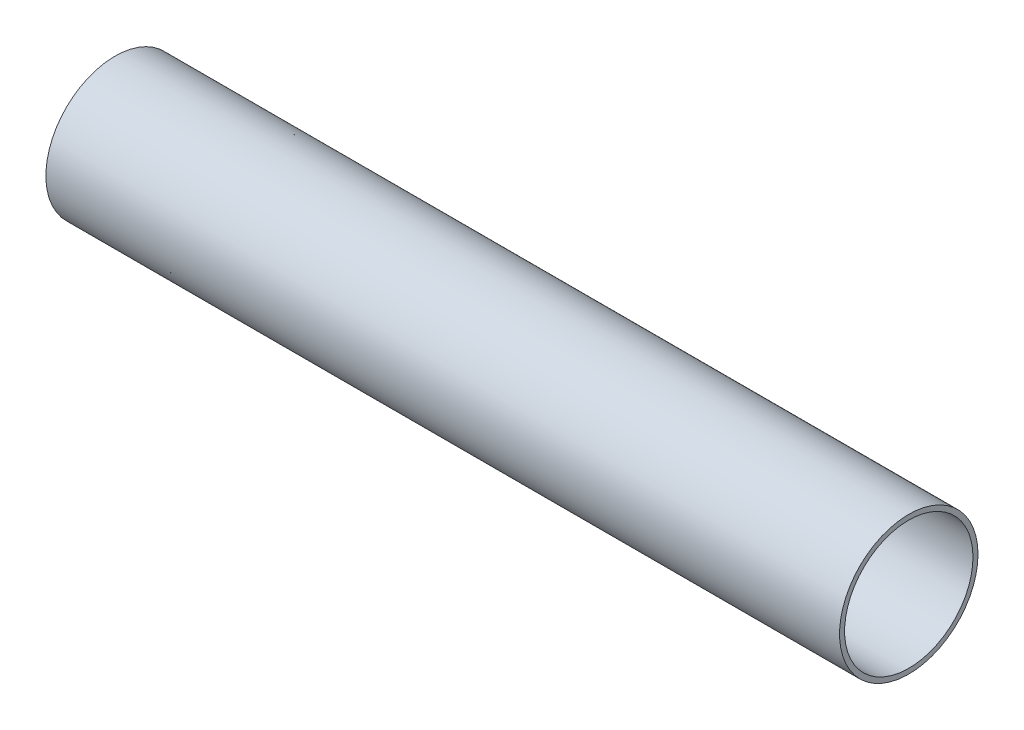
ISO-10303-21;
HEADER;
FILE_DESCRIPTION(('STEP AP214'),'2;1');
FILE_NAME('part.step','',(''),(''),'','','');
FILE_SCHEMA(('AUTOMOTIVE_DESIGN { 1 0 10303 214 1 1 1 1 }'));
ENDSEC;
DATA;
#1=APPLICATION_CONTEXT('core data for automotive mechanical design processes');
#2=APPLICATION_PROTOCOL_DEFINITION('international standard','automotive_design',2000,#1);
#3=PRODUCT_CONTEXT('',#1,'mechanical');
#4=PRODUCT('Part','Part','',(#3));
#5=PRODUCT_RELATED_PRODUCT_CATEGORY('part','',(#4));
#6=PRODUCT_DEFINITION_FORMATION('','',#4);
#7=PRODUCT_DEFINITION_CONTEXT('part definition',#1,'design');
#8=PRODUCT_DEFINITION('design','',#6,#7);
#9=PRODUCT_DEFINITION_SHAPE('','',#8);
#10=(LENGTH_UNIT() NAMED_UNIT(*) SI_UNIT(.MILLI.,.METRE.));
#11=(NAMED_UNIT(*) PLANE_ANGLE_UNIT() SI_UNIT($,.RADIAN.));
#12=(NAMED_UNIT(*) SI_UNIT($,.STERADIAN.) SOLID_ANGLE_UNIT());
#13=UNCERTAINTY_MEASURE_WITH_UNIT(LENGTH_MEASURE(1.E-05),#10,'distance_accuracy_value','');
#14=(GEOMETRIC_REPRESENTATION_CONTEXT(3) GLOBAL_UNCERTAINTY_ASSIGNED_CONTEXT((#13)) GLOBAL_UNIT_ASSIGNED_CONTEXT((#10,
#11,#12)) REPRESENTATION_CONTEXT('',''));
#15=CARTESIAN_POINT('',(0.,0.,0.));
#16=DIRECTION('',(0.,0.,1.));
#17=DIRECTION('',(1.,0.,0.));
#18=AXIS2_PLACEMENT_3D('',#15,#16,#17);
#19=CARTESIAN_POINT('',(-431.8,0.,0.));
#20=DIRECTION('',(1.,0.,0.));
#21=DIRECTION('',(0.,0.,-1.));
#22=AXIS2_PLACEMENT_3D('',#19,#20,#21);
#23=CYLINDRICAL_SURFACE('',#22,34.925);
#24=CARTESIAN_POINT('',(0.,0.,0.));
#25=DIRECTION('',(1.,0.,0.));
#26=DIRECTION('',(0.,0.,-1.));
#27=AXIS2_PLACEMENT_3D('',#24,#25,#26);
#28=CIRCLE('',#27,34.925);
#29=CARTESIAN_POINT('',(0.,0.,-34.925));
#30=VERTEX_POINT('',#29);
#31=EDGE_CURVE('E48',#30,#30,#28,.T.);
#32=ORIENTED_EDGE('',*,*,#31,.T.);
#33=EDGE_LOOP('',(#32));
#34=FACE_BOUND('',#33,.T.);
#35=CARTESIAN_POINT('',(-404.622,0.,0.));
#36=DIRECTION('',(-1.,0.,0.));
#37=DIRECTION('',(0.,0.,1.));
#38=AXIS2_PLACEMENT_3D('',#35,#36,#37);
#39=CIRCLE('',#38,34.925);
#40=CARTESIAN_POINT('',(-404.622,0.,34.925));
#41=VERTEX_POINT('',#40);
#42=EDGE_CURVE('E51',#41,#41,#39,.T.);
#43=ORIENTED_EDGE('',*,*,#42,.T.);
#44=EDGE_LOOP('',(#43));
#45=FACE_BOUND('',#44,.T.);
#46=ADVANCED_FACE('F35',(#34,#45),#23,.F.);
#47=CARTESIAN_POINT('',(-431.8,0.,0.));
#48=DIRECTION('',(1.,0.,0.));
#49=DIRECTION('',(0.,0.,-1.));
#50=AXIS2_PLACEMENT_3D('',#47,#48,#49);
#51=CIRCLE('',#50,34.925);
#52=CARTESIAN_POINT('',(-431.8,0.,-34.925));
#53=VERTEX_POINT('',#52);
#54=EDGE_CURVE('E46',#53,#53,#51,.T.);
#55=ORIENTED_EDGE('',*,*,#54,.F.);
#56=EDGE_LOOP('',(#55));
#57=FACE_BOUND('',#56,.T.);
#58=CARTESIAN_POINT('',(-405.6126,0.,0.));
#59=DIRECTION('',(-1.,0.,0.));
#60=DIRECTION('',(0.,0.,1.));
#61=AXIS2_PLACEMENT_3D('',#58,#59,#60);
#62=CIRCLE('',#61,34.925);
#63=CARTESIAN_POINT('',(-405.6126,0.,34.925));
#64=VERTEX_POINT('',#63);
#65=EDGE_CURVE('E56',#64,#64,#62,.T.);
#66=ORIENTED_EDGE('',*,*,#65,.F.);
#67=EDGE_LOOP('',(#66));
#68=FACE_BOUND('',#67,.T.);
#69=ADVANCED_FACE('F80',(#57,#68),#23,.F.);
#70=CARTESIAN_POINT('',(-431.8,0.,0.));
#71=DIRECTION('',(1.,0.,0.));
#72=DIRECTION('',(0.,0.,-1.));
#73=AXIS2_PLACEMENT_3D('',#70,#71,#72);
#74=CYLINDRICAL_SURFACE('',#73,37.6555);
#75=CARTESIAN_POINT('',(-431.8,0.,0.));
#76=DIRECTION('',(1.,0.,0.));
#77=DIRECTION('',(0.,0.,-1.));
#78=AXIS2_PLACEMENT_3D('',#75,#76,#77);
#79=CIRCLE('',#78,37.6555);
#80=CARTESIAN_POINT('',(-431.8,0.,-37.6555));
#81=VERTEX_POINT('',#80);
#82=EDGE_CURVE('E10',#81,#81,#79,.T.);
#83=ORIENTED_EDGE('',*,*,#82,.T.);
#84=EDGE_LOOP('',(#83));
#85=FACE_BOUND('',#84,.T.);
#86=CARTESIAN_POINT('',(0.,0.,0.));
#87=DIRECTION('',(1.,0.,0.));
#88=DIRECTION('',(0.,0.,-1.));
#89=AXIS2_PLACEMENT_3D('',#86,#87,#88);
#90=CIRCLE('',#89,37.6555);
#91=CARTESIAN_POINT('',(0.,0.,-37.6555));
#92=VERTEX_POINT('',#91);
#93=EDGE_CURVE('E39',#92,#92,#90,.T.);
#94=ORIENTED_EDGE('',*,*,#93,.F.);
#95=EDGE_LOOP('',(#94));
#96=FACE_BOUND('',#95,.T.);
#97=ADVANCED_FACE('F37',(#85,#96),#74,.T.);
#98=CARTESIAN_POINT('',(-431.8,0.,0.));
#99=DIRECTION('',(1.,0.,0.));
#100=DIRECTION('',(0.,0.,-1.));
#101=AXIS2_PLACEMENT_3D('',#98,#99,#100);
#102=PLANE('',#101);
#103=ORIENTED_EDGE('',*,*,#54,.T.);
#104=EDGE_LOOP('',(#103));
#105=FACE_BOUND('',#104,.T.);
#106=ORIENTED_EDGE('',*,*,#82,.F.);
#107=EDGE_LOOP('',(#106));
#108=FACE_BOUND('',#107,.T.);
#109=ADVANCED_FACE('F90',(#105,#108),#102,.F.);
#110=CARTESIAN_POINT('',(0.,0.,0.));
#111=DIRECTION('',(1.,0.,0.));
#112=DIRECTION('',(0.,0.,-1.));
#113=AXIS2_PLACEMENT_3D('',#110,#111,#112);
#114=PLANE('',#113);
#115=ORIENTED_EDGE('',*,*,#31,.F.);
#116=EDGE_LOOP('',(#115));
#117=FACE_BOUND('',#116,.T.);
#118=ORIENTED_EDGE('',*,*,#93,.T.);
#119=EDGE_LOOP('',(#118));
#120=FACE_BOUND('',#119,.T.);
#121=ADVANCED_FACE('F92',(#117,#120),#114,.T.);
#122=CARTESIAN_POINT('',(-404.622,34.925,0.));
#123=DIRECTION('',(-1.,0.,0.));
#124=DIRECTION('',(0.,0.,1.));
#125=AXIS2_PLACEMENT_3D('',#122,#123,#124);
#126=PLANE('',#125);
#127=CARTESIAN_POINT('',(-404.622,0.,0.));
#128=DIRECTION('',(-1.,0.,0.));
#129=DIRECTION('',(0.,0.,1.));
#130=AXIS2_PLACEMENT_3D('',#127,#128,#129);
#131=CIRCLE('',#130,35.8902);
#132=CARTESIAN_POINT('',(-404.622,0.,35.8902));
#133=VERTEX_POINT('',#132);
#134=EDGE_CURVE('E62',#133,#133,#131,.T.);
#135=ORIENTED_EDGE('',*,*,#134,.T.);
#136=EDGE_LOOP('',(#135));
#137=FACE_BOUND('',#136,.T.);
#138=ORIENTED_EDGE('',*,*,#42,.F.);
#139=EDGE_LOOP('',(#138));
#140=FACE_BOUND('',#139,.T.);
#141=ADVANCED_FACE('F66',(#137,#140),#126,.T.);
#142=CARTESIAN_POINT('',(-405.6126,34.925,0.));
#143=DIRECTION('',(1.,0.,0.));
#144=DIRECTION('',(0.,0.,-1.));
#145=AXIS2_PLACEMENT_3D('',#142,#143,#144);
#146=PLANE('',#145);
#147=ORIENTED_EDGE('',*,*,#65,.T.);
#148=EDGE_LOOP('',(#147));
#149=FACE_BOUND('',#148,.T.);
#150=CARTESIAN_POINT('',(-405.6126,0.,0.));
#151=DIRECTION('',(-1.,0.,0.));
#152=DIRECTION('',(0.,0.,1.));
#153=AXIS2_PLACEMENT_3D('',#150,#151,#152);
#154=CIRCLE('',#153,35.8902);
#155=CARTESIAN_POINT('',(-405.6126,0.,35.8902));
#156=VERTEX_POINT('',#155);
#157=EDGE_CURVE('E59',#156,#156,#154,.T.);
#158=ORIENTED_EDGE('',*,*,#157,.F.);
#159=EDGE_LOOP('',(#158));
#160=FACE_BOUND('',#159,.T.);
#161=ADVANCED_FACE('F71',(#149,#160),#146,.T.);
#162=CARTESIAN_POINT('',(-431.8,0.,0.));
#163=DIRECTION('',(-1.,0.,0.));
#164=DIRECTION('',(0.,0.,1.));
#165=AXIS2_PLACEMENT_3D('',#162,#163,#164);
#166=CYLINDRICAL_SURFACE('',#165,35.8902);
#167=ORIENTED_EDGE('',*,*,#157,.T.);
#168=EDGE_LOOP('',(#167));
#169=FACE_BOUND('',#168,.T.);
#170=ORIENTED_EDGE('',*,*,#134,.F.);
#171=EDGE_LOOP('',(#170));
#172=FACE_BOUND('',#171,.T.);
#173=ADVANCED_FACE('F69',(#169,#172),#166,.F.);
#174=CLOSED_SHELL('',(#46,#69,#97,#109,#121,#141,#161,#173));
#175=MANIFOLD_SOLID_BREP('B2',#174);
#176=ADVANCED_BREP_SHAPE_REPRESENTATION('',(#18,#175),#14);
#177=SHAPE_DEFINITION_REPRESENTATION(#9,#176);
ENDSEC;
END-ISO-10303-21;
